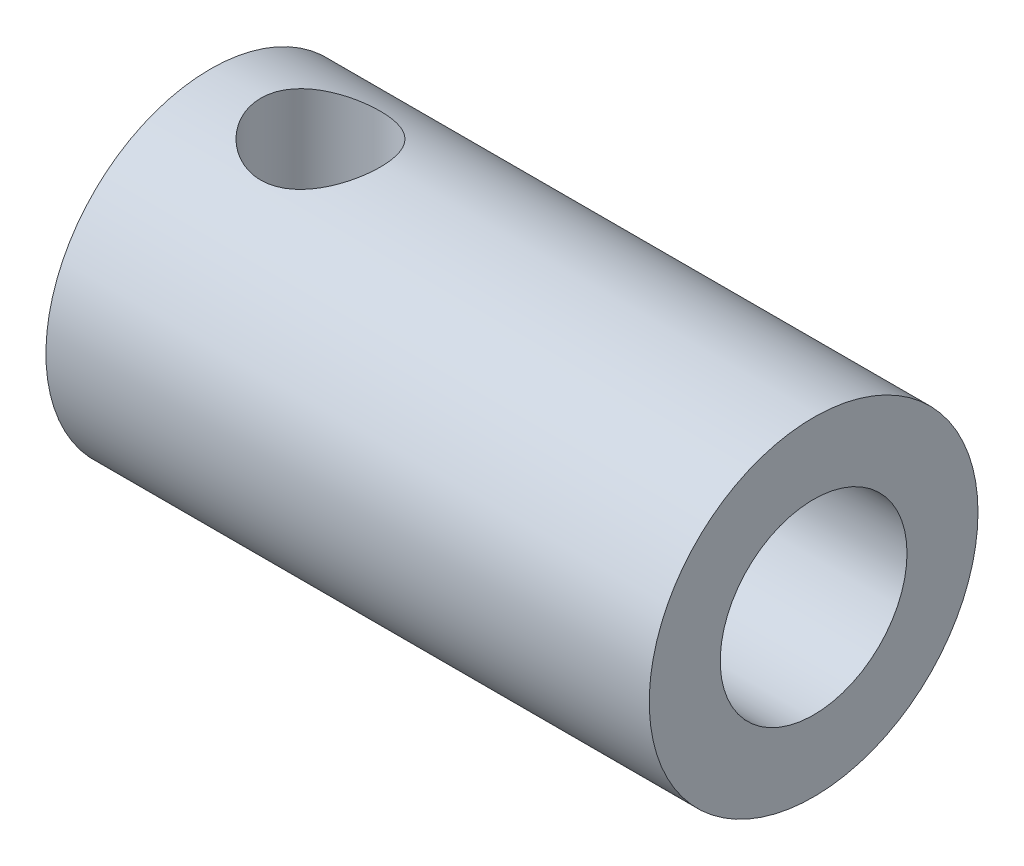
ISO-10303-21;
HEADER;
FILE_DESCRIPTION(('STEP AP214'),'2;1');
FILE_NAME('part.step','',(''),(''),'','','');
FILE_SCHEMA(('AUTOMOTIVE_DESIGN { 1 0 10303 214 1 1 1 1 }'));
ENDSEC;
DATA;
#1=APPLICATION_CONTEXT('core data for automotive mechanical design processes');
#2=APPLICATION_PROTOCOL_DEFINITION('international standard','automotive_design',2000,#1);
#3=PRODUCT_CONTEXT('',#1,'mechanical');
#4=PRODUCT('Part','Part','',(#3));
#5=PRODUCT_RELATED_PRODUCT_CATEGORY('part','',(#4));
#6=PRODUCT_DEFINITION_FORMATION('','',#4);
#7=PRODUCT_DEFINITION_CONTEXT('part definition',#1,'design');
#8=PRODUCT_DEFINITION('design','',#6,#7);
#9=PRODUCT_DEFINITION_SHAPE('','',#8);
#10=(LENGTH_UNIT() NAMED_UNIT(*) SI_UNIT(.MILLI.,.METRE.));
#11=(NAMED_UNIT(*) PLANE_ANGLE_UNIT() SI_UNIT($,.RADIAN.));
#12=(NAMED_UNIT(*) SI_UNIT($,.STERADIAN.) SOLID_ANGLE_UNIT());
#13=UNCERTAINTY_MEASURE_WITH_UNIT(LENGTH_MEASURE(1.E-05),#10,'distance_accuracy_value','');
#14=(GEOMETRIC_REPRESENTATION_CONTEXT(3) GLOBAL_UNCERTAINTY_ASSIGNED_CONTEXT((#13)) GLOBAL_UNIT_ASSIGNED_CONTEXT((#10,
#11,#12)) REPRESENTATION_CONTEXT('',''));
#15=CARTESIAN_POINT('',(0.,0.,0.));
#16=DIRECTION('',(0.,0.,1.));
#17=DIRECTION('',(1.,0.,0.));
#18=AXIS2_PLACEMENT_3D('',#15,#16,#17);
#19=CARTESIAN_POINT('',(0.,0.,0.));
#20=DIRECTION('',(1.,0.,0.));
#21=DIRECTION('',(0.,0.,-1.));
#22=AXIS2_PLACEMENT_3D('',#19,#20,#21);
#23=PLANE('',#22);
#24=CARTESIAN_POINT('',(0.,0.,0.));
#25=DIRECTION('',(1.,0.,0.));
#26=DIRECTION('',(0.,0.,-1.));
#27=AXIS2_PLACEMENT_3D('',#24,#25,#26);
#28=CIRCLE('',#27,6.25);
#29=CARTESIAN_POINT('',(0.,0.,-6.25));
#30=VERTEX_POINT('',#29);
#31=EDGE_CURVE('E71',#30,#30,#28,.T.);
#32=ORIENTED_EDGE('',*,*,#31,.F.);
#33=EDGE_LOOP('',(#32));
#34=FACE_BOUND('',#33,.T.);
#35=CARTESIAN_POINT('',(0.,0.,0.));
#36=DIRECTION('',(1.,0.,0.));
#37=DIRECTION('',(0.,0.,-1.));
#38=AXIS2_PLACEMENT_3D('',#35,#36,#37);
#39=CIRCLE('',#38,11.);
#40=CARTESIAN_POINT('',(0.,0.,-11.));
#41=VERTEX_POINT('',#40);
#42=EDGE_CURVE('E76',#41,#41,#39,.T.);
#43=ORIENTED_EDGE('',*,*,#42,.T.);
#44=EDGE_LOOP('',(#43));
#45=FACE_BOUND('',#44,.T.);
#46=ADVANCED_FACE('F45',(#34,#45),#23,.T.);
#47=CARTESIAN_POINT('',(0.,0.,0.));
#48=DIRECTION('',(1.,0.,0.));
#49=DIRECTION('',(0.,0.,-1.));
#50=AXIS2_PLACEMENT_3D('',#47,#48,#49);
#51=CYLINDRICAL_SURFACE('',#50,11.);
#52=CARTESIAN_POINT('',(-29.,-11.,0.));
#53=CARTESIAN_POINT('',(-28.9999997091985,-11.0000002266035,0.108518126730551));
#54=CARTESIAN_POINT('',(-29.0044197456947,-10.9983905152736,0.217031291286828));
#55=CARTESIAN_POINT('',(-29.0220557982116,-10.9919958444977,0.433282286858839));
#56=CARTESIAN_POINT('',(-29.0352747337615,-10.9872098311367,0.541019848527069));
#57=CARTESIAN_POINT('',(-29.070377041252,-10.974591868663,0.754845156135571));
#58=CARTESIAN_POINT('',(-29.0922563523902,-10.9667613471338,0.860933651119266));
#59=CARTESIAN_POINT('',(-29.1444637720567,-10.948268071833,1.07077170667979));
#60=CARTESIAN_POINT('',(-29.1747951582507,-10.9376042193867,1.17452034296748));
#61=CARTESIAN_POINT('',(-29.2779413022817,-10.9018115251346,1.48070658102079));
#62=CARTESIAN_POINT('',(-29.363014071624,-10.87284149435,1.6787218035831));
#63=CARTESIAN_POINT('',(-29.5630694431103,-10.8075711970341,2.0575471390773));
#64=CARTESIAN_POINT('',(-29.6780595331468,-10.7712690958962,2.2383529292299));
#65=CARTESIAN_POINT('',(-29.9395658358852,-10.6934621497492,2.58506410023189));
#66=CARTESIAN_POINT('',(-30.0870755238332,-10.6518162138018,2.75018962657562));
#67=CARTESIAN_POINT('',(-30.4073160693506,-10.5687333537322,3.05397061311697));
#68=CARTESIAN_POINT('',(-30.5800539684573,-10.5272964913166,3.1926186580755));
#69=CARTESIAN_POINT('',(-30.9533099378625,-10.4477077406823,3.44434007802447));
#70=CARTESIAN_POINT('',(-31.1545945012608,-10.4097238850119,3.55633540053699));
#71=CARTESIAN_POINT('',(-31.5747429951594,-10.3435224438057,3.74453898705226));
#72=CARTESIAN_POINT('',(-31.7936003445409,-10.3153012229272,3.8207605760118));
#73=CARTESIAN_POINT('',(-32.2337173026078,-10.2733217519027,3.93221347681206));
#74=CARTESIAN_POINT('',(-32.4545498684796,-10.2590420728435,3.96892832679582));
#75=CARTESIAN_POINT('',(-32.8996675144434,-10.2450315499348,4.00496437646059));
#76=CARTESIAN_POINT('',(-33.1239512430484,-10.2452951489004,4.00429985930538));
#77=CARTESIAN_POINT('',(-33.556304404392,-10.2598897010115,3.9667353520313));
#78=CARTESIAN_POINT('',(-33.7645808103988,-10.2734357628875,3.93185708350965));
#79=CARTESIAN_POINT('',(-34.1720929236816,-10.3117702146974,3.83018484188759));
#80=CARTESIAN_POINT('',(-34.3713273469324,-10.3365601958857,3.76338635132346));
#81=CARTESIAN_POINT('',(-34.7593527250734,-10.3950857466581,3.59860097073734));
#82=CARTESIAN_POINT('',(-34.9478878800661,-10.4289757937509,3.50006900994908));
#83=CARTESIAN_POINT('',(-35.3063495031204,-10.5018277186453,3.27499293131234));
#84=CARTESIAN_POINT('',(-35.4762697970366,-10.5407912698963,3.14843956116525));
#85=CARTESIAN_POINT('',(-35.8039194190023,-10.6223913991554,2.8615335188553));
#86=CARTESIAN_POINT('',(-35.960209827737,-10.6651048608665,2.69955565645731));
#87=CARTESIAN_POINT('',(-36.243822020991,-10.7472749968053,2.35118575653671));
#88=CARTESIAN_POINT('',(-36.371139869133,-10.7867312280236,2.16479040692935));
#89=CARTESIAN_POINT('',(-36.5946543249824,-10.8586443938877,1.76938296495498));
#90=CARTESIAN_POINT('',(-36.6903984458778,-10.8909975120577,1.56009488084763));
#91=CARTESIAN_POINT('',(-36.8448502852333,-10.9442944138682,1.12691583824632));
#92=CARTESIAN_POINT('',(-36.9035734311181,-10.9652429495427,0.903031005501423));
#93=CARTESIAN_POINT('',(-36.9796120261481,-10.9925485792709,0.459144334705344));
#94=CARTESIAN_POINT('',(-36.9988669289858,-10.9995884573107,0.239516377870323));
#95=CARTESIAN_POINT('',(-37.0010350703573,-11.000375906375,-0.199918267125682));
#96=CARTESIAN_POINT('',(-36.9839558018958,-10.9941262180368,-0.419724909092753));
#97=CARTESIAN_POINT('',(-36.915433187168,-10.9694878447191,-0.845072521461444));
#98=CARTESIAN_POINT('',(-36.8652375506814,-10.9515401846331,-1.05084266917498));
#99=CARTESIAN_POINT('',(-36.7335262876697,-10.9057517766266,-1.45091434019333));
#100=CARTESIAN_POINT('',(-36.6520065875519,-10.8779097420102,-1.64521436805339));
#101=CARTESIAN_POINT('',(-36.4574088865169,-10.8141114350021,-2.02306155277977));
#102=CARTESIAN_POINT('',(-36.3434933005234,-10.7779454574911,-2.20614086670042));
#103=CARTESIAN_POINT('',(-36.0882938002727,-10.7015304514978,-2.55118135413002));
#104=CARTESIAN_POINT('',(-35.9470002295438,-10.6612799847708,-2.71313504261065));
#105=CARTESIAN_POINT('',(-35.6319844236687,-10.5784236071447,-3.02054310021129));
#106=CARTESIAN_POINT('',(-35.4569148836275,-10.5358088331608,-3.16461797559928));
#107=CARTESIAN_POINT('',(-35.0842180332134,-10.4551865738395,-3.42158820330241));
#108=CARTESIAN_POINT('',(-34.8865893119306,-10.4171793769787,-3.53448160393528));
#109=CARTESIAN_POINT('',(-34.4732541050891,-10.3503083856098,-3.72578370287002));
#110=CARTESIAN_POINT('',(-34.2575104022611,-10.3214640275618,-3.80411923102385));
#111=CARTESIAN_POINT('',(-33.8145651058715,-10.2769217525539,-3.92287909704736));
#112=CARTESIAN_POINT('',(-33.5873701087179,-10.2612163567435,-3.96332500370449));
#113=CARTESIAN_POINT('',(-33.1428173778833,-10.245684564914,-4.00329400870131));
#114=CARTESIAN_POINT('',(-32.9256992434912,-10.2449524765479,-4.00515133459015));
#115=CARTESIAN_POINT('',(-32.4944208875212,-10.2571513340792,-3.97380469606995));
#116=CARTESIAN_POINT('',(-32.2802604201375,-10.2700811375568,-3.94060366327266));
#117=CARTESIAN_POINT('',(-31.866810012332,-10.3074143716416,-3.84185635502996));
#118=CARTESIAN_POINT('',(-31.6672748008298,-10.3314989932263,-3.77720646952883));
#119=CARTESIAN_POINT('',(-31.2817547206642,-10.3882601958123,-3.61816905534695));
#120=CARTESIAN_POINT('',(-31.0957731887646,-10.4209388835117,-3.52377423404448));
#121=CARTESIAN_POINT('',(-30.7325159918647,-10.4932450950565,-3.30242059699186));
#122=CARTESIAN_POINT('',(-30.5561430082033,-10.5331386916912,-3.17406750901297));
#123=CARTESIAN_POINT('',(-30.2267038973655,-10.6144069431908,-2.89069247186911));
#124=CARTESIAN_POINT('',(-30.0736449756608,-10.6557820510733,-2.73566230925594));
#125=CARTESIAN_POINT('',(-29.7873845827261,-10.7378363882956,-2.39397199284934));
#126=CARTESIAN_POINT('',(-29.6555460530903,-10.7783791122736,-2.20612371257195));
#127=CARTESIAN_POINT('',(-29.4830096624685,-10.8335715016764,-1.90891818998114));
#128=CARTESIAN_POINT('',(-29.4296775820772,-10.8510404830929,-1.80721425027755));
#129=CARTESIAN_POINT('',(-29.3318380014904,-10.8836243786452,-1.59930059227859));
#130=CARTESIAN_POINT('',(-29.2873266903681,-10.8987403087857,-1.49309284399238));
#131=CARTESIAN_POINT('',(-29.2067915970331,-10.9264345993577,-1.27489280734879));
#132=CARTESIAN_POINT('',(-29.1709422186251,-10.9389601841027,-1.16282946614281));
#133=CARTESIAN_POINT('',(-29.1092087167668,-10.9607217675006,-0.935724899330616));
#134=CARTESIAN_POINT('',(-29.0833203175034,-10.9699591774954,-0.820684974125044));
#135=CARTESIAN_POINT('',(-29.0417805263787,-10.9848588981606,-0.588557121003286));
#136=CARTESIAN_POINT('',(-29.0261277910032,-10.9905216780269,-0.471469463940868));
#137=CARTESIAN_POINT('',(-29.0052380983037,-10.9980919569957,-0.236252522632225));
#138=CARTESIAN_POINT('',(-29.0000003165411,-10.9999997533393,-0.118123321577329));
#139=CARTESIAN_POINT('',(-29.,-11.,0.));
#140=B_SPLINE_CURVE_WITH_KNOTS('',3,(#52,#53,#54,#55,#56,#57,#58,#59,#60,#61,#62,#63,#64,#65,
#66,#67,#68,#69,#70,#71,#72,#73,#74,#75,#76,#77,#78,#79,#80,#81,#82,#83,#84,#85,#86,#87,#88,#89,
#90,#91,#92,#93,#94,#95,#96,#97,#98,#99,#100,#101,#102,#103,#104,#105,#106,#107,#108,#109,#110,
#111,#112,#113,#114,#115,#116,#117,#118,#119,#120,#121,#122,#123,#124,#125,#126,#127,#128,#129,
#130,#131,#132,#133,#134,#135,#136,#137,#138,#139),.UNSPECIFIED.,.T.,.F.,(4,2,2,2,2,2,2,2,2,2,2,
2,2,2,2,2,2,2,2,2,2,2,2,2,2,2,2,2,2,2,2,2,2,2,2,2,2,2,2,2,2,2,2,4),(0.,0.325443648957583,
0.650995335994742,0.97639455412615,1.30192013622567,1.95105392468347,2.60035033892998,
3.27323297532265,3.946303782625,4.64318153392666,5.33979950664272,6.00923247398734,
6.67840964364273,7.31028887354452,7.94225755574645,8.58571857958294,9.22939238340806,
9.91355007110899,10.5978006569502,11.2914695442274,11.9848491735715,12.6432497998948,
13.3015146608895,13.9362952861595,14.57115849054,15.2242188602319,15.8775099911052,
16.5663909087157,17.2553149343625,17.9456907139931,18.6356732557809,19.2837885019669,
19.9318495564598,20.562434512506,21.1931741906942,21.8555070493752,22.5180441958994,
23.213470834282,23.561586764772,23.9095519657129,24.2640282921888,24.6183522872603,
24.9726297650878,25.3268791975035),.UNSPECIFIED.);
#141=CARTESIAN_POINT('',(-29.,-11.,0.));
#142=VERTEX_POINT('',#141);
#143=EDGE_CURVE('E11',#142,#142,#140,.T.);
#144=ORIENTED_EDGE('',*,*,#143,.F.);
#145=EDGE_LOOP('',(#144));
#146=FACE_BOUND('',#145,.T.);
#147=CARTESIAN_POINT('',(-33.,10.2469507659596,4.));
#148=CARTESIAN_POINT('',(-32.8917504160979,10.2469504699696,4.00000030662983));
#149=CARTESIAN_POINT('',(-32.7835058808108,10.2486708349055,3.99560193497926));
#150=CARTESIAN_POINT('',(-32.5677997794328,10.2554947015887,3.97805441925551));
#151=CARTESIAN_POINT('',(-32.4603384884958,10.2605993393065,3.96490233689171));
#152=CARTESIAN_POINT('',(-32.2470683843315,10.2740250056033,3.92998227359779));
#153=CARTESIAN_POINT('',(-32.1412589500989,10.2823447936181,3.90821761574851));
#154=CARTESIAN_POINT('',(-31.9319859566713,10.3019303981195,3.85629233827134));
#155=CARTESIAN_POINT('',(-31.8285233401169,10.3131973763976,3.82612840732077));
#156=CARTESIAN_POINT('',(-31.5232747096157,10.3508540386456,3.72359729442928));
#157=CARTESIAN_POINT('',(-31.3259030819083,10.3811487245755,3.63907040666935));
#158=CARTESIAN_POINT('',(-30.9481834137468,10.4486960026029,3.44030588061466));
#159=CARTESIAN_POINT('',(-30.7678401622105,10.4859505433097,3.32605991809585));
#160=CARTESIAN_POINT('',(-30.4207260410231,10.5651740317019,3.06535488156893));
#161=CARTESIAN_POINT('',(-30.2548557382591,10.6072759431049,2.91773466886007));
#162=CARTESIAN_POINT('',(-29.9496043798575,10.6903361883517,2.59694732439543));
#163=CARTESIAN_POINT('',(-29.8102285519086,10.7312942951513,2.42377516287099));
#164=CARTESIAN_POINT('',(-29.5576386710281,10.8090206819713,2.05002215864278));
#165=CARTESIAN_POINT('',(-29.4453949034652,10.8456148116142,1.84874605750952));
#166=CARTESIAN_POINT('',(-29.2567305645772,10.9089013338837,1.42860460193309));
#167=CARTESIAN_POINT('',(-29.1802983650071,10.9355969400359,1.20974498404862));
#168=CARTESIAN_POINT('',(-29.0685593013358,10.9751356624098,0.770124157582171));
#169=CARTESIAN_POINT('',(-29.031701853271,10.9884994889796,0.549804801082045));
#170=CARTESIAN_POINT('',(-28.9952012405885,11.0017318487959,0.105729901609781));
#171=CARTESIAN_POINT('',(-28.9955466934319,11.0016045097777,-0.118024569411227));
#172=CARTESIAN_POINT('',(-29.0325161007895,10.9882062904678,-0.551543677559226));
#173=CARTESIAN_POINT('',(-29.0674500321021,10.9755477028673,-0.761474591119411));
#174=CARTESIAN_POINT('',(-29.1697755838414,10.9393026535399,-1.1722611364645));
#175=CARTESIAN_POINT('',(-29.2371694839427,10.9157154242952,-1.3731161297606));
#176=CARTESIAN_POINT('',(-29.403342256076,10.8595473030836,-1.7634332434384));
#177=CARTESIAN_POINT('',(-29.5025540697829,10.8268432131035,-1.95269258296048));
#178=CARTESIAN_POINT('',(-29.7291714324873,10.7557780292554,-2.31233500700221));
#179=CARTESIAN_POINT('',(-29.8565857627214,10.717415174698,-2.48271218745521));
#180=CARTESIAN_POINT('',(-30.1442424590067,10.6365074104111,-2.80974230506316));
#181=CARTESIAN_POINT('',(-30.3059110333139,10.5938485516184,-2.96511445886615));
#182=CARTESIAN_POINT('',(-30.6532987950018,10.5108799606252,-3.24700550535835));
#183=CARTESIAN_POINT('',(-30.8390232878932,10.4705707494896,-3.37351801603379));
#184=CARTESIAN_POINT('',(-31.234018175029,10.3961729374343,-3.59634677958791));
#185=CARTESIAN_POINT('',(-31.4436815832974,10.3622231223971,-3.69201638194881));
#186=CARTESIAN_POINT('',(-31.8776997849349,10.3059891279359,-3.84621963772448));
#187=CARTESIAN_POINT('',(-32.1020469210066,10.2836989219196,-3.90477247928874));
#188=CARTESIAN_POINT('',(-32.5464716984057,10.2547128682984,-3.98025412930361));
#189=CARTESIAN_POINT('',(-32.7661564204412,10.2472606408592,-3.99920444010678));
#190=CARTESIAN_POINT('',(-33.2056454095845,10.2466602899651,-4.00074586441125));
#191=CARTESIAN_POINT('',(-33.4254496377775,10.2535088900534,-3.98334530624462));
#192=CARTESIAN_POINT('',(-33.8489151617627,10.2799741586477,-3.91450770014846));
#193=CARTESIAN_POINT('',(-34.0528625325253,10.2990214843113,-3.86458675302146));
#194=CARTESIAN_POINT('',(-34.4494089811847,10.3470765189402,-3.73400767491581));
#195=CARTESIAN_POINT('',(-34.6420058104946,10.3760861937667,-3.6533434770544));
#196=CARTESIAN_POINT('',(-35.0180814421261,10.4420835687377,-3.46029256484251));
#197=CARTESIAN_POINT('',(-35.2009829794024,10.4793207301803,-3.34686904543972));
#198=CARTESIAN_POINT('',(-35.5458789491071,10.5571404296612,-3.09264194937228));
#199=CARTESIAN_POINT('',(-35.7078661009803,10.597724124656,-2.95182888059568));
#200=CARTESIAN_POINT('',(-36.0162327799907,10.6805566360805,-2.63698574907421));
#201=CARTESIAN_POINT('',(-36.1611289560666,10.7227625465894,-2.46148671223774));
#202=CARTESIAN_POINT('',(-36.4195691519594,10.801772003322,-2.08762445497427));
#203=CARTESIAN_POINT('',(-36.5331134879083,10.8385756040174,-1.88926146512139));
#204=CARTESIAN_POINT('',(-36.7247720760206,10.9025582886549,-1.47571973127324));
#205=CARTESIAN_POINT('',(-36.803046178165,10.9297806706004,-1.26062214375716));
#206=CARTESIAN_POINT('',(-36.921895875697,10.9716971284869,-0.819106278750293));
#207=CARTESIAN_POINT('',(-36.9624880018407,10.986396697844,-0.592693011332962));
#208=CARTESIAN_POINT('',(-37.0031196453269,11.0011202577645,-0.148422612865205));
#209=CARTESIAN_POINT('',(-37.0052721685089,11.0019088942898,0.0692177520046489));
#210=CARTESIAN_POINT('',(-36.9743358385657,10.990684039421,0.501620277586911));
#211=CARTESIAN_POINT('',(-36.9412508165628,10.978671939758,0.716382748621494));
#212=CARTESIAN_POINT('',(-36.8422433459317,10.9435263755784,1.13219500017516));
#213=CARTESIAN_POINT('',(-36.7770535018565,10.9206414137559,1.33344178351665));
#214=CARTESIAN_POINT('',(-36.6164030357785,10.8661252023275,1.72217606507432));
#215=CARTESIAN_POINT('',(-36.5209367118918,10.8344923053914,1.9096609633568));
#216=CARTESIAN_POINT('',(-36.2979851872553,10.7640650596328,2.27392320384075));
#217=CARTESIAN_POINT('',(-36.1693523273145,10.7250311420033,2.4499513616771));
#218=CARTESIAN_POINT('',(-35.8856053416903,10.644632223817,2.77857497661478));
#219=CARTESIAN_POINT('',(-35.7304820117719,10.6032664163924,2.93116225395154));
#220=CARTESIAN_POINT('',(-35.3889807389636,10.5203897284407,3.21629286030741));
#221=CARTESIAN_POINT('',(-35.2014458787969,10.4789705467868,3.34749226042282));
#222=CARTESIAN_POINT('',(-34.9048559776026,10.4220441710315,3.51918131662223));
#223=CARTESIAN_POINT('',(-34.8033813301751,10.4039267666486,3.57224951721933));
#224=CARTESIAN_POINT('',(-34.5959531894741,10.3699865661811,3.66960969450072));
#225=CARTESIAN_POINT('',(-34.49000166699,10.3541627737286,3.71390548508931));
#226=CARTESIAN_POINT('',(-34.2723084061951,10.3250623769048,3.79406680722068));
#227=CARTESIAN_POINT('',(-34.1604951587085,10.3118394280838,3.82975762963529));
#228=CARTESIAN_POINT('',(-33.9338794514302,10.2888014601454,3.89122643963254));
#229=CARTESIAN_POINT('',(-33.8190783250527,10.2789849479339,3.91700877079477));
#230=CARTESIAN_POINT('',(-33.5874229812817,10.2631241434736,3.95838036727015));
#231=CARTESIAN_POINT('',(-33.4705692653989,10.2570789426044,3.97397208784567));
#232=CARTESIAN_POINT('',(-33.2358083116493,10.2489925798478,3.99478131021302));
#233=CARTESIAN_POINT('',(-33.1179011613133,10.2469510883402,3.99999966603093));
#234=CARTESIAN_POINT('',(-33.,10.2469507659596,4.));
#235=B_SPLINE_CURVE_WITH_KNOTS('',3,(#147,#148,#149,#150,#151,#152,#153,#154,#155,#156,#157,
#158,#159,#160,#161,#162,#163,#164,#165,#166,#167,#168,#169,#170,#171,#172,#173,#174,#175,#176,
#177,#178,#179,#180,#181,#182,#183,#184,#185,#186,#187,#188,#189,#190,#191,#192,#193,#194,#195,
#196,#197,#198,#199,#200,#201,#202,#203,#204,#205,#206,#207,#208,#209,#210,#211,#212,#213,#214,
#215,#216,#217,#218,#219,#220,#221,#222,#223,#224,#225,#226,#227,#228,#229,#230,#231,#232,#233,
#234),.UNSPECIFIED.,.T.,.F.,(4,2,2,2,2,2,2,2,2,2,2,2,2,2,2,2,2,2,2,2,2,2,2,2,2,2,2,2,2,2,2,2,2,
2,2,2,2,2,2,2,2,2,2,4),(0.,0.324636921167099,0.649382865699336,0.974003632061784,
1.29875255829124,1.94606900427897,2.59356695726273,3.2685386494129,3.94364338393151,
4.64016629218057,5.33646287798335,6.00435251148736,6.67203779914635,7.30863295161357,
7.94527281889399,8.59097164609222,9.23687180390772,9.91850618255109,10.6002911518276,
11.2955593238533,11.9904677712503,12.6489400049561,13.307261392915,13.9368978907213,
14.5666587055818,15.2190747569981,15.8717173136229,16.562839911392,17.2539555400668,
17.9419066238557,18.6295557666501,19.2792812244987,19.9289360496267,20.5644089686855,
21.2000016357014,21.8615318897015,22.5232924648319,23.2173925311364,23.5648465647152,
23.9121492054987,24.2660005453776,24.6196965902301,24.9733073863118,25.3268890688555),.UNSPECIFIED.);
#236=CARTESIAN_POINT('',(-33.,10.2469507659596,4.));
#237=VERTEX_POINT('',#236);
#238=EDGE_CURVE('E56',#237,#237,#235,.T.);
#239=ORIENTED_EDGE('',*,*,#238,.F.);
#240=EDGE_LOOP('',(#239));
#241=FACE_BOUND('',#240,.T.);
#242=CARTESIAN_POINT('',(-40.3730669589464,0.,0.));
#243=DIRECTION('',(1.,0.,0.));
#244=DIRECTION('',(0.,0.,-1.));
#245=AXIS2_PLACEMENT_3D('',#242,#243,#244);
#246=CIRCLE('',#245,11.);
#247=CARTESIAN_POINT('',(-40.3730669589464,0.,-11.));
#248=VERTEX_POINT('',#247);
#249=EDGE_CURVE('E70',#248,#248,#246,.T.);
#250=ORIENTED_EDGE('',*,*,#249,.T.);
#251=EDGE_LOOP('',(#250));
#252=FACE_BOUND('',#251,.T.);
#253=ORIENTED_EDGE('',*,*,#42,.F.);
#254=EDGE_LOOP('',(#253));
#255=FACE_BOUND('',#254,.T.);
#256=ADVANCED_FACE('F88',(#146,#241,#252,#255),#51,.T.);
#257=CARTESIAN_POINT('',(-4.,0.,0.));
#258=DIRECTION('',(1.,0.,0.));
#259=DIRECTION('',(0.,1.,0.));
#260=AXIS2_PLACEMENT_3D('',#257,#258,#259);
#261=SPHERICAL_SURFACE('',#260,38.);
#262=ORIENTED_EDGE('',*,*,#249,.F.);
#263=EDGE_LOOP('',(#262));
#264=FACE_BOUND('',#263,.T.);
#265=ADVANCED_FACE('F63',(#264),#261,.T.);
#266=CARTESIAN_POINT('',(-24.,0.,0.));
#267=DIRECTION('',(1.,0.,0.));
#268=DIRECTION('',(0.,0.,-1.));
#269=AXIS2_PLACEMENT_3D('',#266,#267,#268);
#270=CONICAL_SURFACE('',#269,6.25,1.02974425867665);
#271=CARTESIAN_POINT('',(-27.7553788689223,0.,0.));
#272=VERTEX_POINT('',#271);
#273=VERTEX_LOOP('',#272);
#274=FACE_BOUND('',#273,.T.);
#275=CARTESIAN_POINT('',(-24.,0.,0.));
#276=DIRECTION('',(1.,0.,0.));
#277=DIRECTION('',(0.,0.,-1.));
#278=AXIS2_PLACEMENT_3D('',#275,#276,#277);
#279=CIRCLE('',#278,6.25);
#280=CARTESIAN_POINT('',(-24.,0.,-6.25));
#281=VERTEX_POINT('',#280);
#282=EDGE_CURVE('E67',#281,#281,#279,.T.);
#283=ORIENTED_EDGE('',*,*,#282,.T.);
#284=EDGE_LOOP('',(#283));
#285=FACE_BOUND('',#284,.T.);
#286=ADVANCED_FACE('F59',(#274,#285),#270,.F.);
#287=CARTESIAN_POINT('',(0.,0.,0.));
#288=DIRECTION('',(1.,0.,0.));
#289=DIRECTION('',(0.,0.,-1.));
#290=AXIS2_PLACEMENT_3D('',#287,#288,#289);
#291=CYLINDRICAL_SURFACE('',#290,6.25);
#292=ORIENTED_EDGE('',*,*,#282,.F.);
#293=EDGE_LOOP('',(#292));
#294=FACE_BOUND('',#293,.T.);
#295=ORIENTED_EDGE('',*,*,#31,.T.);
#296=EDGE_LOOP('',(#295));
#297=FACE_BOUND('',#296,.T.);
#298=ADVANCED_FACE('F62',(#294,#297),#291,.F.);
#299=CARTESIAN_POINT('',(-33.,-11.,0.));
#300=DIRECTION('',(0.,1.,0.));
#301=DIRECTION('',(0.,0.,1.));
#302=AXIS2_PLACEMENT_3D('',#299,#300,#301);
#303=CYLINDRICAL_SURFACE('',#302,4.);
#304=ORIENTED_EDGE('',*,*,#143,.T.);
#305=EDGE_LOOP('',(#304));
#306=FACE_BOUND('',#305,.T.);
#307=ORIENTED_EDGE('',*,*,#238,.T.);
#308=EDGE_LOOP('',(#307));
#309=FACE_BOUND('',#308,.T.);
#310=ADVANCED_FACE('F91',(#306,#309),#303,.F.);
#311=CLOSED_SHELL('',(#46,#256,#265,#286,#298,#310));
#312=MANIFOLD_SOLID_BREP('B2',#311);
#313=ADVANCED_BREP_SHAPE_REPRESENTATION('',(#18,#312),#14);
#314=SHAPE_DEFINITION_REPRESENTATION(#9,#313);
ENDSEC;
END-ISO-10303-21;
